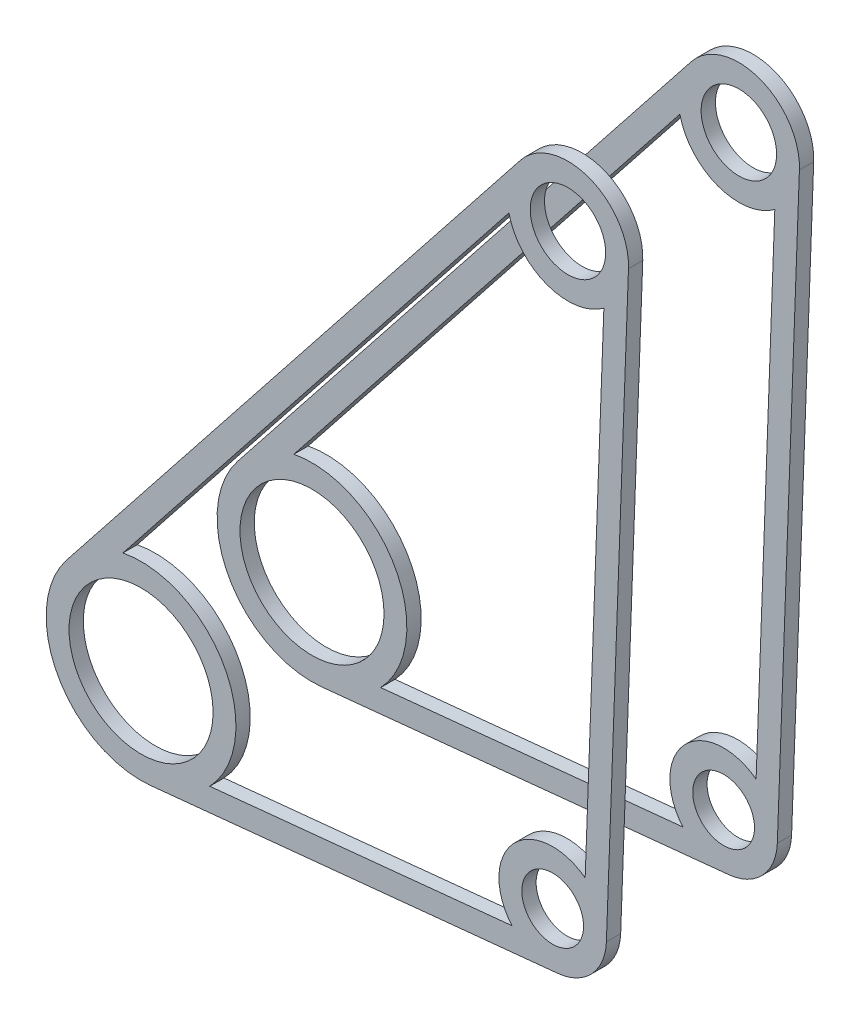
ISO-10303-21;
HEADER;
FILE_DESCRIPTION(('STEP AP214'),'2;1');
FILE_NAME('part.step','',(''),(''),'','','');
FILE_SCHEMA(('AUTOMOTIVE_DESIGN { 1 0 10303 214 1 1 1 1 }'));
ENDSEC;
DATA;
#1=APPLICATION_CONTEXT('core data for automotive mechanical design processes');
#2=APPLICATION_PROTOCOL_DEFINITION('international standard','automotive_design',2000,#1);
#3=PRODUCT_CONTEXT('',#1,'mechanical');
#4=PRODUCT('Part','Part','',(#3));
#5=PRODUCT_RELATED_PRODUCT_CATEGORY('part','',(#4));
#6=PRODUCT_DEFINITION_FORMATION('','',#4);
#7=PRODUCT_DEFINITION_CONTEXT('part definition',#1,'design');
#8=PRODUCT_DEFINITION('design','',#6,#7);
#9=PRODUCT_DEFINITION_SHAPE('','',#8);
#10=(LENGTH_UNIT() NAMED_UNIT(*) SI_UNIT(.MILLI.,.METRE.));
#11=(NAMED_UNIT(*) PLANE_ANGLE_UNIT() SI_UNIT($,.RADIAN.));
#12=(NAMED_UNIT(*) SI_UNIT($,.STERADIAN.) SOLID_ANGLE_UNIT());
#13=UNCERTAINTY_MEASURE_WITH_UNIT(LENGTH_MEASURE(1.E-05),#10,'distance_accuracy_value','');
#14=(GEOMETRIC_REPRESENTATION_CONTEXT(3) GLOBAL_UNCERTAINTY_ASSIGNED_CONTEXT((#13)) GLOBAL_UNIT_ASSIGNED_CONTEXT((#10,
#11,#12)) REPRESENTATION_CONTEXT('',''));
#15=CARTESIAN_POINT('',(0.,0.,0.));
#16=DIRECTION('',(0.,0.,1.));
#17=DIRECTION('',(1.,0.,0.));
#18=AXIS2_PLACEMENT_3D('',#15,#16,#17);
#19=CARTESIAN_POINT('',(45.72,0.,-10.287));
#20=DIRECTION('',(0.,0.,1.));
#21=DIRECTION('',(1.,0.,0.));
#22=AXIS2_PLACEMENT_3D('',#19,#20,#21);
#23=CYLINDRICAL_SURFACE('',#22,5.96900000000001);
#24=CARTESIAN_POINT('',(45.72,0.,-8.6995));
#25=DIRECTION('',(0.,0.,1.));
#26=DIRECTION('',(1.,0.,0.));
#27=AXIS2_PLACEMENT_3D('',#24,#25,#26);
#28=CIRCLE('',#27,5.96900000000001);
#29=CARTESIAN_POINT('',(46.3169,-5.93908001208942,-8.6995));
#30=VERTEX_POINT('',#29);
#31=CARTESIAN_POINT('',(51.6848742778661,-0.221891525865466,-8.6995));
#32=VERTEX_POINT('',#31);
#33=EDGE_CURVE('E206',#30,#32,#28,.T.);
#34=ORIENTED_EDGE('',*,*,#33,.F.);
#35=DIRECTION('',(0.,0.,1.));
#36=VECTOR('',#35,1.);
#37=CARTESIAN_POINT('',(46.3169,-5.93908001208942,-10.287));
#38=LINE('',#37,#36);
#39=CARTESIAN_POINT('',(46.3169,-5.93908001208942,-10.287));
#40=VERTEX_POINT('',#39);
#41=EDGE_CURVE('E12',#40,#30,#38,.T.);
#42=ORIENTED_EDGE('',*,*,#41,.F.);
#43=CARTESIAN_POINT('',(45.72,0.,-10.287));
#44=DIRECTION('',(0.,0.,1.));
#45=DIRECTION('',(1.,0.,0.));
#46=AXIS2_PLACEMENT_3D('',#43,#44,#45);
#47=CIRCLE('',#46,5.96900000000001);
#48=CARTESIAN_POINT('',(51.6848742778661,-0.221891525865466,-10.287));
#49=VERTEX_POINT('',#48);
#50=EDGE_CURVE('E306',#40,#49,#47,.T.);
#51=ORIENTED_EDGE('',*,*,#50,.T.);
#52=DIRECTION('',(0.,0.,1.));
#53=VECTOR('',#52,1.);
#54=CARTESIAN_POINT('',(51.6848742778661,-0.221891525865466,-10.287));
#55=LINE('',#54,#53);
#56=EDGE_CURVE('E228',#49,#32,#55,.T.);
#57=ORIENTED_EDGE('',*,*,#56,.T.);
#58=EDGE_LOOP('',(#34,#42,#51,#57));
#59=FACE_BOUND('',#58,.T.);
#60=ADVANCED_FACE('F57',(#59),#23,.T.);
#61=CARTESIAN_POINT('',(1.0541,-10.4881625745409,-10.287));
#62=DIRECTION('',(-0.1,0.99498743710662,0.));
#63=DIRECTION('',(-0.99498743710662,-0.1,0.));
#64=AXIS2_PLACEMENT_3D('',#61,#62,#63);
#65=PLANE('',#64);
#66=DIRECTION('',(-0.99498743710662,-0.1,0.));
#67=VECTOR('',#66,1.);
#68=CARTESIAN_POINT('',(1.0541,-10.4881625745409,-8.6995));
#69=LINE('',#68,#67);
#70=CARTESIAN_POINT('',(1.0541,-10.4881625745409,-8.6995));
#71=VERTEX_POINT('',#70);
#72=EDGE_CURVE('E218',#30,#71,#69,.T.);
#73=ORIENTED_EDGE('',*,*,#72,.T.);
#74=DIRECTION('',(0.,0.,1.));
#75=VECTOR('',#74,1.);
#76=CARTESIAN_POINT('',(1.0541,-10.4881625745409,-10.287));
#77=LINE('',#76,#75);
#78=CARTESIAN_POINT('',(1.0541,-10.4881625745409,-10.287));
#79=VERTEX_POINT('',#78);
#80=EDGE_CURVE('E67',#79,#71,#77,.T.);
#81=ORIENTED_EDGE('',*,*,#80,.F.);
#82=DIRECTION('',(-0.99498743710662,-0.1,0.));
#83=VECTOR('',#82,1.);
#84=CARTESIAN_POINT('',(1.0541,-10.4881625745409,-10.287));
#85=LINE('',#84,#83);
#86=EDGE_CURVE('E174',#40,#79,#85,.T.);
#87=ORIENTED_EDGE('',*,*,#86,.F.);
#88=ORIENTED_EDGE('',*,*,#41,.T.);
#89=EDGE_LOOP('',(#73,#81,#87,#88));
#90=FACE_BOUND('',#89,.T.);
#91=ADVANCED_FACE('F265',(#90),#65,.F.);
#92=CARTESIAN_POINT('',(0.,0.,-10.287));
#93=DIRECTION('',(0.,0.,1.));
#94=DIRECTION('',(1.,0.,0.));
#95=AXIS2_PLACEMENT_3D('',#92,#93,#94);
#96=CYLINDRICAL_SURFACE('',#95,10.541);
#97=CARTESIAN_POINT('',(0.,0.,-8.6995));
#98=DIRECTION('',(0.,0.,1.));
#99=DIRECTION('',(1.,0.,0.));
#100=AXIS2_PLACEMENT_3D('',#97,#98,#99);
#101=CIRCLE('',#100,10.541);
#102=CARTESIAN_POINT('',(-8.26410474188352,6.54348942195052,-8.6995));
#103=VERTEX_POINT('',#102);
#104=EDGE_CURVE('E157',#103,#71,#101,.T.);
#105=ORIENTED_EDGE('',*,*,#104,.F.);
#106=DIRECTION('',(0.,0.,1.));
#107=VECTOR('',#106,1.);
#108=CARTESIAN_POINT('',(-8.26410474188352,6.54348942195052,-10.287));
#109=LINE('',#108,#107);
#110=CARTESIAN_POINT('',(-8.26410474188352,6.54348942195052,-10.287));
#111=VERTEX_POINT('',#110);
#112=EDGE_CURVE('E151',#111,#103,#109,.T.);
#113=ORIENTED_EDGE('',*,*,#112,.F.);
#114=CARTESIAN_POINT('',(0.,0.,-10.287));
#115=DIRECTION('',(0.,0.,1.));
#116=DIRECTION('',(1.,0.,0.));
#117=AXIS2_PLACEMENT_3D('',#114,#115,#116);
#118=CIRCLE('',#117,10.541);
#119=EDGE_CURVE('E155',#111,#79,#118,.T.);
#120=ORIENTED_EDGE('',*,*,#119,.T.);
#121=ORIENTED_EDGE('',*,*,#80,.T.);
#122=EDGE_LOOP('',(#105,#113,#120,#121));
#123=FACE_BOUND('',#122,.T.);
#124=ADVANCED_FACE('F153',(#123),#96,.T.);
#125=CARTESIAN_POINT('',(-8.26410474188352,6.54348942195053,-10.287));
#126=DIRECTION('',(0.783996275674368,-0.620765527174891,0.));
#127=DIRECTION('',(0.620765527174891,0.783996275674368,0.));
#128=AXIS2_PLACEMENT_3D('',#125,#126,#127);
#129=PLANE('',#128);
#130=DIRECTION('',(0.620765527174891,0.783996275674368,0.));
#131=VECTOR('',#130,1.);
#132=CARTESIAN_POINT('',(-8.26410474188352,6.54348942195053,-8.6995));
#133=LINE('',#132,#131);
#134=CARTESIAN_POINT('',(42.1362544017692,70.1966597922536,-8.6995));
#135=VERTEX_POINT('',#134);
#136=EDGE_CURVE('E215',#103,#135,#133,.T.);
#137=ORIENTED_EDGE('',*,*,#136,.T.);
#138=DIRECTION('',(0.,0.,1.));
#139=VECTOR('',#138,1.);
#140=CARTESIAN_POINT('',(42.1362544017692,70.1966597922536,-10.287));
#141=LINE('',#140,#139);
#142=CARTESIAN_POINT('',(42.1362544017692,70.1966597922536,-10.287));
#143=VERTEX_POINT('',#142);
#144=EDGE_CURVE('E161',#143,#135,#141,.T.);
#145=ORIENTED_EDGE('',*,*,#144,.F.);
#146=DIRECTION('',(0.620765527174891,0.783996275674368,0.));
#147=VECTOR('',#146,1.);
#148=CARTESIAN_POINT('',(-8.26410474188352,6.54348942195053,-10.287));
#149=LINE('',#148,#147);
#150=EDGE_CURVE('E164',#111,#143,#149,.T.);
#151=ORIENTED_EDGE('',*,*,#150,.F.);
#152=ORIENTED_EDGE('',*,*,#112,.T.);
#153=EDGE_LOOP('',(#137,#145,#151,#152));
#154=FACE_BOUND('',#153,.T.);
#155=ADVANCED_FACE('F165',(#154),#129,.F.);
#156=CARTESIAN_POINT('',(47.4133333333333,66.0182870288394,-10.287));
#157=DIRECTION('',(0.,0.,1.));
#158=DIRECTION('',(1.,0.,0.));
#159=AXIS2_PLACEMENT_3D('',#156,#157,#158);
#160=CYLINDRICAL_SURFACE('',#159,6.73099999999992);
#161=CARTESIAN_POINT('',(47.4133333333333,66.0182870288394,-8.6995));
#162=DIRECTION('',(0.,0.,1.));
#163=DIRECTION('',(1.,0.,0.));
#164=AXIS2_PLACEMENT_3D('',#161,#162,#163);
#165=CIRCLE('',#164,6.73099999999992);
#166=CARTESIAN_POINT('',(54.1396809232675,65.7680689252039,-8.6995));
#167=VERTEX_POINT('',#166);
#168=EDGE_CURVE('E212',#167,#135,#165,.T.);
#169=ORIENTED_EDGE('',*,*,#168,.F.);
#170=DIRECTION('',(0.,0.,1.));
#171=VECTOR('',#170,1.);
#172=CARTESIAN_POINT('',(54.1396809232675,65.7680689252039,-10.287));
#173=LINE('',#172,#171);
#174=CARTESIAN_POINT('',(54.1396809232675,65.7680689252039,-10.287));
#175=VERTEX_POINT('',#174);
#176=EDGE_CURVE('E226',#175,#167,#173,.T.);
#177=ORIENTED_EDGE('',*,*,#176,.F.);
#178=CARTESIAN_POINT('',(47.4133333333333,66.0182870288394,-10.287));
#179=DIRECTION('',(0.,0.,1.));
#180=DIRECTION('',(1.,0.,0.));
#181=AXIS2_PLACEMENT_3D('',#178,#179,#180);
#182=CIRCLE('',#181,6.73099999999992);
#183=EDGE_CURVE('E169',#175,#143,#182,.T.);
#184=ORIENTED_EDGE('',*,*,#183,.T.);
#185=ORIENTED_EDGE('',*,*,#144,.T.);
#186=EDGE_LOOP('',(#169,#177,#184,#185));
#187=FACE_BOUND('',#186,.T.);
#188=ADVANCED_FACE('F315',(#187),#160,.T.);
#189=CARTESIAN_POINT('',(49.0834491950019,-1.82588952076208,-10.287));
#190=DIRECTION('',(0.999308808488212,-0.0371739865748812,0.));
#191=DIRECTION('',(0.0371739865748812,0.999308808488212,0.));
#192=AXIS2_PLACEMENT_3D('',#189,#190,#191);
#193=PLANE('',#192);
#194=DIRECTION('',(0.0371739865748812,0.999308808488212,0.));
#195=VECTOR('',#194,1.);
#196=CARTESIAN_POINT('',(49.0834491950019,-1.82588952076208,-8.6995));
#197=LINE('',#196,#195);
#198=CARTESIAN_POINT('',(49.3282541051594,4.75494093681516,-8.6995));
#199=VERTEX_POINT('',#198);
#200=CARTESIAN_POINT('',(51.4056390768177,60.5990752918299,-8.6995));
#201=VERTEX_POINT('',#200);
#202=EDGE_CURVE('E185',#199,#201,#197,.T.);
#203=ORIENTED_EDGE('',*,*,#202,.T.);
#204=DIRECTION('',(0.,0.,1.));
#205=VECTOR('',#204,1.);
#206=CARTESIAN_POINT('',(51.4056390768177,60.5990752918299,-10.287));
#207=LINE('',#206,#205);
#208=CARTESIAN_POINT('',(51.4056390768177,60.5990752918299,-10.287));
#209=VERTEX_POINT('',#208);
#210=EDGE_CURVE('E230',#209,#201,#207,.T.);
#211=ORIENTED_EDGE('',*,*,#210,.F.);
#212=DIRECTION('',(0.0371739865748812,0.999308808488212,0.));
#213=VECTOR('',#212,1.);
#214=CARTESIAN_POINT('',(49.0834491950019,-1.82588952076208,-10.287));
#215=LINE('',#214,#213);
#216=CARTESIAN_POINT('',(49.3282541051594,4.75494093681516,-10.287));
#217=VERTEX_POINT('',#216);
#218=EDGE_CURVE('E243',#217,#209,#215,.T.);
#219=ORIENTED_EDGE('',*,*,#218,.F.);
#220=DIRECTION('',(0.,0.,1.));
#221=VECTOR('',#220,1.);
#222=CARTESIAN_POINT('',(49.3282541051594,4.75494093681516,-10.287));
#223=LINE('',#222,#221);
#224=EDGE_CURVE('E61',#217,#199,#223,.T.);
#225=ORIENTED_EDGE('',*,*,#224,.T.);
#226=EDGE_LOOP('',(#203,#211,#219,#225));
#227=FACE_BOUND('',#226,.T.);
#228=ADVANCED_FACE('F241',(#227),#193,.F.);
#229=CARTESIAN_POINT('',(47.4133333333333,66.0182870288394,-10.287));
#230=DIRECTION('',(0.,0.,1.));
#231=DIRECTION('',(1.,0.,0.));
#232=AXIS2_PLACEMENT_3D('',#229,#230,#231);
#233=CYLINDRICAL_SURFACE('',#232,6.73099999999992);
#234=CARTESIAN_POINT('',(47.4133333333333,66.0182870288394,-8.6995));
#235=DIRECTION('',(0.,0.,1.));
#236=DIRECTION('',(1.,0.,0.));
#237=AXIS2_PLACEMENT_3D('',#234,#235,#236);
#238=CIRCLE('',#237,6.73099999999992);
#239=CARTESIAN_POINT('',(40.857998083081,64.4905629841252,-8.6995));
#240=VERTEX_POINT('',#239);
#241=EDGE_CURVE('E200',#240,#201,#238,.T.);
#242=ORIENTED_EDGE('',*,*,#241,.F.);
#243=DIRECTION('',(0.,0.,1.));
#244=VECTOR('',#243,1.);
#245=CARTESIAN_POINT('',(40.857998083081,64.4905629841252,-10.287));
#246=LINE('',#245,#244);
#247=CARTESIAN_POINT('',(40.857998083081,64.4905629841252,-10.287));
#248=VERTEX_POINT('',#247);
#249=EDGE_CURVE('E232',#248,#240,#246,.T.);
#250=ORIENTED_EDGE('',*,*,#249,.F.);
#251=CARTESIAN_POINT('',(47.4133333333333,66.0182870288394,-10.287));
#252=DIRECTION('',(0.,0.,1.));
#253=DIRECTION('',(1.,0.,0.));
#254=AXIS2_PLACEMENT_3D('',#251,#252,#253);
#255=CIRCLE('',#254,6.73099999999992);
#256=EDGE_CURVE('E300',#248,#209,#255,.T.);
#257=ORIENTED_EDGE('',*,*,#256,.T.);
#258=ORIENTED_EDGE('',*,*,#210,.T.);
#259=EDGE_LOOP('',(#242,#250,#257,#258));
#260=FACE_BOUND('',#259,.T.);
#261=ADVANCED_FACE('F273',(#260),#233,.T.);
#262=CARTESIAN_POINT('',(-6.27275420167062,4.9667449829263,-10.287));
#263=DIRECTION('',(0.783996275674368,-0.620765527174891,0.));
#264=DIRECTION('',(0.620765527174891,0.783996275674368,0.));
#265=AXIS2_PLACEMENT_3D('',#262,#263,#264);
#266=PLANE('',#265);
#267=DIRECTION('',(0.620765527174891,0.783996275674368,0.));
#268=VECTOR('',#267,1.);
#269=CARTESIAN_POINT('',(-6.27275420167062,4.9667449829263,-8.6995));
#270=LINE('',#269,#268);
#271=CARTESIAN_POINT('',(-2.01262531984617,10.3470778639147,-8.6995));
#272=VERTEX_POINT('',#271);
#273=EDGE_CURVE('E197',#272,#240,#270,.T.);
#274=ORIENTED_EDGE('',*,*,#273,.F.);
#275=DIRECTION('',(0.,0.,1.));
#276=VECTOR('',#275,1.);
#277=CARTESIAN_POINT('',(-2.01262531984617,10.3470778639147,-10.287));
#278=LINE('',#277,#276);
#279=CARTESIAN_POINT('',(-2.01262531984617,10.3470778639147,-10.287));
#280=VERTEX_POINT('',#279);
#281=EDGE_CURVE('E234',#280,#272,#278,.T.);
#282=ORIENTED_EDGE('',*,*,#281,.F.);
#283=DIRECTION('',(0.620765527174891,0.783996275674368,0.));
#284=VECTOR('',#283,1.);
#285=CARTESIAN_POINT('',(-6.27275420167062,4.9667449829263,-10.287));
#286=LINE('',#285,#284);
#287=EDGE_CURVE('E303',#280,#248,#286,.T.);
#288=ORIENTED_EDGE('',*,*,#287,.T.);
#289=ORIENTED_EDGE('',*,*,#249,.T.);
#290=EDGE_LOOP('',(#274,#282,#288,#289));
#291=FACE_BOUND('',#290,.T.);
#292=ADVANCED_FACE('F275',(#291),#266,.T.);
#293=CARTESIAN_POINT('',(0.,0.,-10.287));
#294=DIRECTION('',(0.,0.,1.));
#295=DIRECTION('',(1.,0.,0.));
#296=AXIS2_PLACEMENT_3D('',#293,#294,#295);
#297=CYLINDRICAL_SURFACE('',#296,10.541);
#298=CARTESIAN_POINT('',(0.,0.,-8.6995));
#299=DIRECTION('',(0.,0.,1.));
#300=DIRECTION('',(1.,0.,0.));
#301=AXIS2_PLACEMENT_3D('',#298,#299,#300);
#302=CIRCLE('',#301,10.541);
#303=CARTESIAN_POINT('',(7.62840236588861,-7.27462427511587,-8.6995));
#304=VERTEX_POINT('',#303);
#305=EDGE_CURVE('E194',#304,#272,#302,.T.);
#306=ORIENTED_EDGE('',*,*,#305,.F.);
#307=DIRECTION('',(0.,0.,1.));
#308=VECTOR('',#307,1.);
#309=CARTESIAN_POINT('',(7.62840236588861,-7.27462427511587,-10.287));
#310=LINE('',#309,#308);
#311=CARTESIAN_POINT('',(7.62840236588861,-7.27462427511587,-10.287));
#312=VERTEX_POINT('',#311);
#313=EDGE_CURVE('E236',#312,#304,#310,.T.);
#314=ORIENTED_EDGE('',*,*,#313,.F.);
#315=CARTESIAN_POINT('',(0.,0.,-10.287));
#316=DIRECTION('',(0.,0.,1.));
#317=DIRECTION('',(1.,0.,0.));
#318=AXIS2_PLACEMENT_3D('',#315,#316,#317);
#319=CIRCLE('',#318,10.541);
#320=EDGE_CURVE('E295',#312,#280,#319,.T.);
#321=ORIENTED_EDGE('',*,*,#320,.T.);
#322=ORIENTED_EDGE('',*,*,#281,.T.);
#323=EDGE_LOOP('',(#306,#314,#321,#322));
#324=FACE_BOUND('',#323,.T.);
#325=ADVANCED_FACE('F279',(#324),#297,.T.);
#326=CARTESIAN_POINT('',(0.8001,-7.96089448429007,-10.287));
#327=DIRECTION('',(0.1,-0.99498743710662,0.));
#328=DIRECTION('',(0.99498743710662,0.1,0.));
#329=AXIS2_PLACEMENT_3D('',#326,#327,#328);
#330=PLANE('',#329);
#331=DIRECTION('',(0.99498743710662,0.1,0.));
#332=VECTOR('',#331,1.);
#333=CARTESIAN_POINT('',(0.8001,-7.96089448429007,-8.6995));
#334=LINE('',#333,#332);
#335=CARTESIAN_POINT('',(41.2016027657219,-3.90039067700505,-8.6995));
#336=VERTEX_POINT('',#335);
#337=EDGE_CURVE('E191',#304,#336,#334,.T.);
#338=ORIENTED_EDGE('',*,*,#337,.T.);
#339=DIRECTION('',(0.,0.,1.));
#340=VECTOR('',#339,1.);
#341=CARTESIAN_POINT('',(41.2016027657219,-3.90039067700505,-10.287));
#342=LINE('',#341,#340);
#343=CARTESIAN_POINT('',(41.2016027657219,-3.90039067700505,-10.287));
#344=VERTEX_POINT('',#343);
#345=EDGE_CURVE('E237',#344,#336,#342,.T.);
#346=ORIENTED_EDGE('',*,*,#345,.F.);
#347=DIRECTION('',(0.99498743710662,0.1,0.));
#348=VECTOR('',#347,1.);
#349=CARTESIAN_POINT('',(0.8001,-7.96089448429007,-10.287));
#350=LINE('',#349,#348);
#351=EDGE_CURVE('E505',#312,#344,#350,.T.);
#352=ORIENTED_EDGE('',*,*,#351,.F.);
#353=ORIENTED_EDGE('',*,*,#313,.T.);
#354=EDGE_LOOP('',(#338,#346,#352,#353));
#355=FACE_BOUND('',#354,.T.);
#356=ADVANCED_FACE('F282',(#355),#330,.F.);
#357=CARTESIAN_POINT('',(51.6216935685619,-1.92031144666228,-10.287));
#358=DIRECTION('',(-0.999308808488212,0.0371739865748813,0.));
#359=DIRECTION('',(-0.0371739865748813,-0.999308808488212,0.));
#360=AXIS2_PLACEMENT_3D('',#357,#358,#359);
#361=PLANE('',#360);
#362=DIRECTION('',(-0.0371739865748813,-0.999308808488212,0.));
#363=VECTOR('',#362,1.);
#364=CARTESIAN_POINT('',(51.6216935685619,-1.92031144666228,-8.6995));
#365=LINE('',#364,#363);
#366=EDGE_CURVE('E209',#167,#32,#365,.T.);
#367=ORIENTED_EDGE('',*,*,#366,.T.);
#368=ORIENTED_EDGE('',*,*,#56,.F.);
#369=DIRECTION('',(-0.0371739865748813,-0.999308808488212,0.));
#370=VECTOR('',#369,1.);
#371=CARTESIAN_POINT('',(51.6216935685619,-1.92031144666228,-10.287));
#372=LINE('',#371,#370);
#373=EDGE_CURVE('E312',#175,#49,#372,.T.);
#374=ORIENTED_EDGE('',*,*,#373,.F.);
#375=ORIENTED_EDGE('',*,*,#176,.T.);
#376=EDGE_LOOP('',(#367,#368,#374,#375));
#377=FACE_BOUND('',#376,.T.);
#378=ADVANCED_FACE('F261',(#377),#361,.F.);
#379=CARTESIAN_POINT('',(47.4133333333333,66.0182870288394,-10.287));
#380=DIRECTION('',(0.,0.,1.));
#381=DIRECTION('',(1.,0.,0.));
#382=AXIS2_PLACEMENT_3D('',#379,#380,#381);
#383=CYLINDRICAL_SURFACE('',#382,4.1910000000001);
#384=CARTESIAN_POINT('',(47.4133333333333,66.0182870288394,-10.287));
#385=DIRECTION('',(0.,0.,1.));
#386=DIRECTION('',(1.,0.,0.));
#387=AXIS2_PLACEMENT_3D('',#384,#385,#386);
#388=CIRCLE('',#387,4.1910000000001);
#389=CARTESIAN_POINT('',(51.6043333333335,66.0182870288394,-10.287));
#390=VERTEX_POINT('',#389);
#391=EDGE_CURVE('E302',#390,#390,#388,.T.);
#392=ORIENTED_EDGE('',*,*,#391,.F.);
#393=EDGE_LOOP('',(#392));
#394=FACE_BOUND('',#393,.T.);
#395=CARTESIAN_POINT('',(47.4133333333333,66.0182870288394,-8.6995));
#396=DIRECTION('',(0.,0.,1.));
#397=DIRECTION('',(1.,0.,0.));
#398=AXIS2_PLACEMENT_3D('',#395,#396,#397);
#399=CIRCLE('',#398,4.1910000000001);
#400=CARTESIAN_POINT('',(51.6043333333335,66.0182870288394,-8.6995));
#401=VERTEX_POINT('',#400);
#402=EDGE_CURVE('E203',#401,#401,#399,.T.);
#403=ORIENTED_EDGE('',*,*,#402,.T.);
#404=EDGE_LOOP('',(#403));
#405=FACE_BOUND('',#404,.T.);
#406=ADVANCED_FACE('F252',(#394,#405),#383,.F.);
#407=CARTESIAN_POINT('',(45.72,0.,-10.287));
#408=DIRECTION('',(0.,0.,1.));
#409=DIRECTION('',(1.,0.,0.));
#410=AXIS2_PLACEMENT_3D('',#407,#408,#409);
#411=CYLINDRICAL_SURFACE('',#410,5.96900000000001);
#412=CARTESIAN_POINT('',(45.72,0.,-8.6995));
#413=DIRECTION('',(0.,0.,1.));
#414=DIRECTION('',(1.,0.,0.));
#415=AXIS2_PLACEMENT_3D('',#412,#413,#414);
#416=CIRCLE('',#415,5.96900000000001);
#417=EDGE_CURVE('E188',#199,#336,#416,.T.);
#418=ORIENTED_EDGE('',*,*,#417,.F.);
#419=ORIENTED_EDGE('',*,*,#224,.F.);
#420=CARTESIAN_POINT('',(45.72,0.,-10.287));
#421=DIRECTION('',(0.,0.,1.));
#422=DIRECTION('',(1.,0.,0.));
#423=AXIS2_PLACEMENT_3D('',#420,#421,#422);
#424=CIRCLE('',#423,5.96900000000001);
#425=EDGE_CURVE('E503',#217,#344,#424,.T.);
#426=ORIENTED_EDGE('',*,*,#425,.T.);
#427=ORIENTED_EDGE('',*,*,#345,.T.);
#428=EDGE_LOOP('',(#418,#419,#426,#427));
#429=FACE_BOUND('',#428,.T.);
#430=ADVANCED_FACE('F250',(#429),#411,.T.);
#431=CARTESIAN_POINT('',(45.72,0.,-10.287));
#432=DIRECTION('',(0.,0.,1.));
#433=DIRECTION('',(1.,0.,0.));
#434=AXIS2_PLACEMENT_3D('',#431,#432,#433);
#435=CYLINDRICAL_SURFACE('',#434,3.42899999999998);
#436=CARTESIAN_POINT('',(45.72,0.,-10.287));
#437=DIRECTION('',(0.,0.,1.));
#438=DIRECTION('',(1.,0.,0.));
#439=AXIS2_PLACEMENT_3D('',#436,#437,#438);
#440=CIRCLE('',#439,3.42899999999998);
#441=CARTESIAN_POINT('',(49.149,0.,-10.287));
#442=VERTEX_POINT('',#441);
#443=EDGE_CURVE('E222',#442,#442,#440,.T.);
#444=ORIENTED_EDGE('',*,*,#443,.F.);
#445=EDGE_LOOP('',(#444));
#446=FACE_BOUND('',#445,.T.);
#447=CARTESIAN_POINT('',(45.72,0.,-8.6995));
#448=DIRECTION('',(0.,0.,1.));
#449=DIRECTION('',(1.,0.,0.));
#450=AXIS2_PLACEMENT_3D('',#447,#448,#449);
#451=CIRCLE('',#450,3.42899999999998);
#452=CARTESIAN_POINT('',(49.149,0.,-8.6995));
#453=VERTEX_POINT('',#452);
#454=EDGE_CURVE('E182',#453,#453,#451,.T.);
#455=ORIENTED_EDGE('',*,*,#454,.T.);
#456=EDGE_LOOP('',(#455));
#457=FACE_BOUND('',#456,.T.);
#458=ADVANCED_FACE('F59',(#446,#457),#435,.F.);
#459=CARTESIAN_POINT('',(0.,0.,-10.287));
#460=DIRECTION('',(0.,0.,1.));
#461=DIRECTION('',(1.,0.,0.));
#462=AXIS2_PLACEMENT_3D('',#459,#460,#461);
#463=CYLINDRICAL_SURFACE('',#462,8.001);
#464=CARTESIAN_POINT('',(0.,0.,-10.287));
#465=DIRECTION('',(0.,0.,1.));
#466=DIRECTION('',(1.,0.,0.));
#467=AXIS2_PLACEMENT_3D('',#464,#465,#466);
#468=CIRCLE('',#467,8.001);
#469=CARTESIAN_POINT('',(8.001,0.,-10.287));
#470=VERTEX_POINT('',#469);
#471=EDGE_CURVE('E176',#470,#470,#468,.T.);
#472=ORIENTED_EDGE('',*,*,#471,.F.);
#473=EDGE_LOOP('',(#472));
#474=FACE_BOUND('',#473,.T.);
#475=CARTESIAN_POINT('',(0.,0.,-8.6995));
#476=DIRECTION('',(0.,0.,1.));
#477=DIRECTION('',(1.,0.,0.));
#478=AXIS2_PLACEMENT_3D('',#475,#476,#477);
#479=CIRCLE('',#478,8.001);
#480=CARTESIAN_POINT('',(8.001,0.,-8.6995));
#481=VERTEX_POINT('',#480);
#482=EDGE_CURVE('E220',#481,#481,#479,.T.);
#483=ORIENTED_EDGE('',*,*,#482,.T.);
#484=EDGE_LOOP('',(#483));
#485=FACE_BOUND('',#484,.T.);
#486=ADVANCED_FACE('F258',(#474,#485),#463,.F.);
#487=CARTESIAN_POINT('',(0.,0.,-10.287));
#488=DIRECTION('',(0.,0.,1.));
#489=DIRECTION('',(1.,0.,0.));
#490=AXIS2_PLACEMENT_3D('',#487,#488,#489);
#491=PLANE('',#490);
#492=ORIENTED_EDGE('',*,*,#443,.T.);
#493=EDGE_LOOP('',(#492));
#494=FACE_BOUND('',#493,.T.);
#495=ORIENTED_EDGE('',*,*,#218,.T.);
#496=ORIENTED_EDGE('',*,*,#256,.F.);
#497=ORIENTED_EDGE('',*,*,#287,.F.);
#498=ORIENTED_EDGE('',*,*,#320,.F.);
#499=ORIENTED_EDGE('',*,*,#351,.T.);
#500=ORIENTED_EDGE('',*,*,#425,.F.);
#501=EDGE_LOOP('',(#495,#496,#497,#498,#499,#500));
#502=FACE_BOUND('',#501,.T.);
#503=ORIENTED_EDGE('',*,*,#391,.T.);
#504=EDGE_LOOP('',(#503));
#505=FACE_BOUND('',#504,.T.);
#506=ORIENTED_EDGE('',*,*,#50,.F.);
#507=ORIENTED_EDGE('',*,*,#86,.T.);
#508=ORIENTED_EDGE('',*,*,#119,.F.);
#509=ORIENTED_EDGE('',*,*,#150,.T.);
#510=ORIENTED_EDGE('',*,*,#183,.F.);
#511=ORIENTED_EDGE('',*,*,#373,.T.);
#512=EDGE_LOOP('',(#506,#507,#508,#509,#510,#511));
#513=FACE_BOUND('',#512,.T.);
#514=ORIENTED_EDGE('',*,*,#471,.T.);
#515=EDGE_LOOP('',(#514));
#516=FACE_BOUND('',#515,.T.);
#517=ADVANCED_FACE('F172',(#494,#502,#505,#513,#516),#491,.F.);
#518=CARTESIAN_POINT('',(0.,0.,-8.6995));
#519=DIRECTION('',(0.,0.,1.));
#520=DIRECTION('',(1.,0.,0.));
#521=AXIS2_PLACEMENT_3D('',#518,#519,#520);
#522=PLANE('',#521);
#523=ORIENTED_EDGE('',*,*,#454,.F.);
#524=EDGE_LOOP('',(#523));
#525=FACE_BOUND('',#524,.T.);
#526=ORIENTED_EDGE('',*,*,#202,.F.);
#527=ORIENTED_EDGE('',*,*,#417,.T.);
#528=ORIENTED_EDGE('',*,*,#337,.F.);
#529=ORIENTED_EDGE('',*,*,#305,.T.);
#530=ORIENTED_EDGE('',*,*,#273,.T.);
#531=ORIENTED_EDGE('',*,*,#241,.T.);
#532=EDGE_LOOP('',(#526,#527,#528,#529,#530,#531));
#533=FACE_BOUND('',#532,.T.);
#534=ORIENTED_EDGE('',*,*,#402,.F.);
#535=EDGE_LOOP('',(#534));
#536=FACE_BOUND('',#535,.T.);
#537=ORIENTED_EDGE('',*,*,#33,.T.);
#538=ORIENTED_EDGE('',*,*,#366,.F.);
#539=ORIENTED_EDGE('',*,*,#168,.T.);
#540=ORIENTED_EDGE('',*,*,#136,.F.);
#541=ORIENTED_EDGE('',*,*,#104,.T.);
#542=ORIENTED_EDGE('',*,*,#72,.F.);
#543=EDGE_LOOP('',(#537,#538,#539,#540,#541,#542));
#544=FACE_BOUND('',#543,.T.);
#545=ORIENTED_EDGE('',*,*,#482,.F.);
#546=EDGE_LOOP('',(#545));
#547=FACE_BOUND('',#546,.T.);
#548=ADVANCED_FACE('F246',(#525,#533,#536,#544,#547),#522,.T.);
#549=CLOSED_SHELL('',(#60,#91,#124,#155,#188,#228,#261,#292,#325,#356,#378,#406,#430,#458,#486,
#517,#548));
#550=MANIFOLD_SOLID_BREP('B2',#549);
#551=CARTESIAN_POINT('',(45.72,0.,10.287));
#552=DIRECTION('',(0.,0.,-1.));
#553=DIRECTION('',(-1.,0.,0.));
#554=AXIS2_PLACEMENT_3D('',#551,#552,#553);
#555=CYLINDRICAL_SURFACE('',#554,5.96900000000001);
#556=CARTESIAN_POINT('',(45.72,0.,8.6995));
#557=DIRECTION('',(0.,0.,1.));
#558=DIRECTION('',(1.,0.,0.));
#559=AXIS2_PLACEMENT_3D('',#556,#557,#558);
#560=CIRCLE('',#559,5.96900000000001);
#561=CARTESIAN_POINT('',(46.3169,-5.93908001208942,8.6995));
#562=VERTEX_POINT('',#561);
#563=CARTESIAN_POINT('',(51.6848742778661,-0.221891525865466,8.6995));
#564=VERTEX_POINT('',#563);
#565=EDGE_CURVE('E668',#562,#564,#560,.T.);
#566=ORIENTED_EDGE('',*,*,#565,.T.);
#567=DIRECTION('',(0.,0.,-1.));
#568=VECTOR('',#567,1.);
#569=CARTESIAN_POINT('',(51.6848742778661,-0.221891525865466,10.287));
#570=LINE('',#569,#568);
#571=CARTESIAN_POINT('',(51.6848742778661,-0.221891525865466,10.287));
#572=VERTEX_POINT('',#571);
#573=EDGE_CURVE('E55',#572,#564,#570,.T.);
#574=ORIENTED_EDGE('',*,*,#573,.F.);
#575=CARTESIAN_POINT('',(45.72,0.,10.287));
#576=DIRECTION('',(0.,0.,1.));
#577=DIRECTION('',(1.,0.,0.));
#578=AXIS2_PLACEMENT_3D('',#575,#576,#577);
#579=CIRCLE('',#578,5.96900000000001);
#580=CARTESIAN_POINT('',(46.3169,-5.93908001208942,10.287));
#581=VERTEX_POINT('',#580);
#582=EDGE_CURVE('E743',#581,#572,#579,.T.);
#583=ORIENTED_EDGE('',*,*,#582,.F.);
#584=DIRECTION('',(0.,0.,-1.));
#585=VECTOR('',#584,1.);
#586=CARTESIAN_POINT('',(46.3169,-5.93908001208942,10.287));
#587=LINE('',#586,#585);
#588=EDGE_CURVE('E533',#581,#562,#587,.T.);
#589=ORIENTED_EDGE('',*,*,#588,.T.);
#590=EDGE_LOOP('',(#566,#574,#583,#589));
#591=FACE_BOUND('',#590,.T.);
#592=ADVANCED_FACE('F514',(#591),#555,.T.);
#593=CARTESIAN_POINT('',(51.6216935685619,-1.92031144666228,10.287));
#594=DIRECTION('',(0.999308808488212,-0.0371739865748813,0.));
#595=DIRECTION('',(0.0371739865748813,0.999308808488212,0.));
#596=AXIS2_PLACEMENT_3D('',#593,#594,#595);
#597=PLANE('',#596);
#598=DIRECTION('',(-0.0371739865748813,-0.999308808488212,0.));
#599=VECTOR('',#598,1.);
#600=CARTESIAN_POINT('',(51.6216935685619,-1.92031144666228,8.6995));
#601=LINE('',#600,#599);
#602=CARTESIAN_POINT('',(54.1396809232675,65.7680689252039,8.6995));
#603=VERTEX_POINT('',#602);
#604=EDGE_CURVE('E670',#603,#564,#601,.T.);
#605=ORIENTED_EDGE('',*,*,#604,.F.);
#606=DIRECTION('',(0.,0.,-1.));
#607=VECTOR('',#606,1.);
#608=CARTESIAN_POINT('',(54.1396809232675,65.7680689252039,10.287));
#609=LINE('',#608,#607);
#610=CARTESIAN_POINT('',(54.1396809232675,65.7680689252039,10.287));
#611=VERTEX_POINT('',#610);
#612=EDGE_CURVE('E524',#611,#603,#609,.T.);
#613=ORIENTED_EDGE('',*,*,#612,.F.);
#614=DIRECTION('',(-0.0371739865748813,-0.999308808488212,0.));
#615=VECTOR('',#614,1.);
#616=CARTESIAN_POINT('',(51.6216935685619,-1.92031144666228,10.287));
#617=LINE('',#616,#615);
#618=EDGE_CURVE('E635',#611,#572,#617,.T.);
#619=ORIENTED_EDGE('',*,*,#618,.T.);
#620=ORIENTED_EDGE('',*,*,#573,.T.);
#621=EDGE_LOOP('',(#605,#613,#619,#620));
#622=FACE_BOUND('',#621,.T.);
#623=ADVANCED_FACE('F747',(#622),#597,.T.);
#624=CARTESIAN_POINT('',(47.4133333333333,66.0182870288394,10.287));
#625=DIRECTION('',(0.,0.,-1.));
#626=DIRECTION('',(-1.,0.,0.));
#627=AXIS2_PLACEMENT_3D('',#624,#625,#626);
#628=CYLINDRICAL_SURFACE('',#627,6.73099999999992);
#629=CARTESIAN_POINT('',(47.4133333333333,66.0182870288394,8.6995));
#630=DIRECTION('',(0.,0.,1.));
#631=DIRECTION('',(1.,0.,0.));
#632=AXIS2_PLACEMENT_3D('',#629,#630,#631);
#633=CIRCLE('',#632,6.73099999999992);
#634=CARTESIAN_POINT('',(42.1362544017692,70.1966597922536,8.6995));
#635=VERTEX_POINT('',#634);
#636=EDGE_CURVE('E673',#603,#635,#633,.T.);
#637=ORIENTED_EDGE('',*,*,#636,.T.);
#638=DIRECTION('',(0.,0.,-1.));
#639=VECTOR('',#638,1.);
#640=CARTESIAN_POINT('',(42.1362544017692,70.1966597922536,10.287));
#641=LINE('',#640,#639);
#642=CARTESIAN_POINT('',(42.1362544017692,70.1966597922536,10.287));
#643=VERTEX_POINT('',#642);
#644=EDGE_CURVE('E620',#643,#635,#641,.T.);
#645=ORIENTED_EDGE('',*,*,#644,.F.);
#646=CARTESIAN_POINT('',(47.4133333333333,66.0182870288394,10.287));
#647=DIRECTION('',(0.,0.,1.));
#648=DIRECTION('',(1.,0.,0.));
#649=AXIS2_PLACEMENT_3D('',#646,#647,#648);
#650=CIRCLE('',#649,6.73099999999992);
#651=EDGE_CURVE('E632',#611,#643,#650,.T.);
#652=ORIENTED_EDGE('',*,*,#651,.F.);
#653=ORIENTED_EDGE('',*,*,#612,.T.);
#654=EDGE_LOOP('',(#637,#645,#652,#653));
#655=FACE_BOUND('',#654,.T.);
#656=ADVANCED_FACE('F753',(#655),#628,.T.);
#657=CARTESIAN_POINT('',(-8.26410474188352,6.54348942195053,10.287));
#658=DIRECTION('',(-0.783996275674368,0.620765527174891,0.));
#659=DIRECTION('',(-0.620765527174891,-0.783996275674368,0.));
#660=AXIS2_PLACEMENT_3D('',#657,#658,#659);
#661=PLANE('',#660);
#662=DIRECTION('',(0.620765527174891,0.783996275674368,0.));
#663=VECTOR('',#662,1.);
#664=CARTESIAN_POINT('',(-8.26410474188352,6.54348942195053,8.6995));
#665=LINE('',#664,#663);
#666=CARTESIAN_POINT('',(-8.26410474188352,6.54348942195052,8.6995));
#667=VERTEX_POINT('',#666);
#668=EDGE_CURVE('E617',#667,#635,#665,.T.);
#669=ORIENTED_EDGE('',*,*,#668,.F.);
#670=DIRECTION('',(0.,0.,-1.));
#671=VECTOR('',#670,1.);
#672=CARTESIAN_POINT('',(-8.26410474188352,6.54348942195052,10.287));
#673=LINE('',#672,#671);
#674=CARTESIAN_POINT('',(-8.26410474188352,6.54348942195052,10.287));
#675=VERTEX_POINT('',#674);
#676=EDGE_CURVE('E611',#675,#667,#673,.T.);
#677=ORIENTED_EDGE('',*,*,#676,.F.);
#678=DIRECTION('',(0.620765527174891,0.783996275674368,0.));
#679=VECTOR('',#678,1.);
#680=CARTESIAN_POINT('',(-8.26410474188352,6.54348942195053,10.287));
#681=LINE('',#680,#679);
#682=EDGE_CURVE('E615',#675,#643,#681,.T.);
#683=ORIENTED_EDGE('',*,*,#682,.T.);
#684=ORIENTED_EDGE('',*,*,#644,.T.);
#685=EDGE_LOOP('',(#669,#677,#683,#684));
#686=FACE_BOUND('',#685,.T.);
#687=ADVANCED_FACE('F613',(#686),#661,.T.);
#688=CARTESIAN_POINT('',(0.,0.,10.287));
#689=DIRECTION('',(0.,0.,-1.));
#690=DIRECTION('',(-1.,0.,0.));
#691=AXIS2_PLACEMENT_3D('',#688,#689,#690);
#692=CYLINDRICAL_SURFACE('',#691,10.541);
#693=CARTESIAN_POINT('',(0.,0.,8.6995));
#694=DIRECTION('',(0.,0.,1.));
#695=DIRECTION('',(1.,0.,0.));
#696=AXIS2_PLACEMENT_3D('',#693,#694,#695);
#697=CIRCLE('',#696,10.541);
#698=CARTESIAN_POINT('',(1.0541,-10.4881625745409,8.6995));
#699=VERTEX_POINT('',#698);
#700=EDGE_CURVE('E677',#667,#699,#697,.T.);
#701=ORIENTED_EDGE('',*,*,#700,.T.);
#702=DIRECTION('',(0.,0.,-1.));
#703=VECTOR('',#702,1.);
#704=CARTESIAN_POINT('',(1.0541,-10.4881625745409,10.287));
#705=LINE('',#704,#703);
#706=CARTESIAN_POINT('',(1.0541,-10.4881625745409,10.287));
#707=VERTEX_POINT('',#706);
#708=EDGE_CURVE('E571',#707,#699,#705,.T.);
#709=ORIENTED_EDGE('',*,*,#708,.F.);
#710=CARTESIAN_POINT('',(0.,0.,10.287));
#711=DIRECTION('',(0.,0.,1.));
#712=DIRECTION('',(1.,0.,0.));
#713=AXIS2_PLACEMENT_3D('',#710,#711,#712);
#714=CIRCLE('',#713,10.541);
#715=EDGE_CURVE('E622',#675,#707,#714,.T.);
#716=ORIENTED_EDGE('',*,*,#715,.F.);
#717=ORIENTED_EDGE('',*,*,#676,.T.);
#718=EDGE_LOOP('',(#701,#709,#716,#717));
#719=FACE_BOUND('',#718,.T.);
#720=ADVANCED_FACE('F623',(#719),#692,.T.);
#721=CARTESIAN_POINT('',(49.0834491950019,-1.82588952076208,10.287));
#722=DIRECTION('',(-0.999308808488212,0.0371739865748812,0.));
#723=DIRECTION('',(-0.0371739865748812,-0.999308808488212,0.));
#724=AXIS2_PLACEMENT_3D('',#721,#722,#723);
#725=PLANE('',#724);
#726=DIRECTION('',(0.0371739865748812,0.999308808488212,0.));
#727=VECTOR('',#726,1.);
#728=CARTESIAN_POINT('',(49.0834491950019,-1.82588952076208,8.6995));
#729=LINE('',#728,#727);
#730=CARTESIAN_POINT('',(49.3282541051594,4.75494093681516,8.6995));
#731=VERTEX_POINT('',#730);
#732=CARTESIAN_POINT('',(51.4056390768177,60.5990752918299,8.6995));
#733=VERTEX_POINT('',#732);
#734=EDGE_CURVE('E647',#731,#733,#729,.T.);
#735=ORIENTED_EDGE('',*,*,#734,.F.);
#736=DIRECTION('',(0.,0.,-1.));
#737=VECTOR('',#736,1.);
#738=CARTESIAN_POINT('',(49.3282541051594,4.75494093681516,10.287));
#739=LINE('',#738,#737);
#740=CARTESIAN_POINT('',(49.3282541051594,4.75494093681516,10.287));
#741=VERTEX_POINT('',#740);
#742=EDGE_CURVE('E518',#741,#731,#739,.T.);
#743=ORIENTED_EDGE('',*,*,#742,.F.);
#744=DIRECTION('',(0.0371739865748812,0.999308808488212,0.));
#745=VECTOR('',#744,1.);
#746=CARTESIAN_POINT('',(49.0834491950019,-1.82588952076208,10.287));
#747=LINE('',#746,#745);
#748=CARTESIAN_POINT('',(51.4056390768177,60.5990752918299,10.287));
#749=VERTEX_POINT('',#748);
#750=EDGE_CURVE('E714',#741,#749,#747,.T.);
#751=ORIENTED_EDGE('',*,*,#750,.T.);
#752=DIRECTION('',(0.,0.,-1.));
#753=VECTOR('',#752,1.);
#754=CARTESIAN_POINT('',(51.4056390768177,60.5990752918299,10.287));
#755=LINE('',#754,#753);
#756=EDGE_CURVE('E643',#749,#733,#755,.T.);
#757=ORIENTED_EDGE('',*,*,#756,.T.);
#758=EDGE_LOOP('',(#735,#743,#751,#757));
#759=FACE_BOUND('',#758,.T.);
#760=ADVANCED_FACE('F712',(#759),#725,.T.);
#761=CARTESIAN_POINT('',(45.72,0.,10.287));
#762=DIRECTION('',(0.,0.,-1.));
#763=DIRECTION('',(-1.,0.,0.));
#764=AXIS2_PLACEMENT_3D('',#761,#762,#763);
#765=CYLINDRICAL_SURFACE('',#764,5.96900000000001);
#766=CARTESIAN_POINT('',(45.72,0.,8.6995));
#767=DIRECTION('',(0.,0.,1.));
#768=DIRECTION('',(1.,0.,0.));
#769=AXIS2_PLACEMENT_3D('',#766,#767,#768);
#770=CIRCLE('',#769,5.96900000000001);
#771=CARTESIAN_POINT('',(41.2016027657219,-3.90039067700505,8.6995));
#772=VERTEX_POINT('',#771);
#773=EDGE_CURVE('E650',#731,#772,#770,.T.);
#774=ORIENTED_EDGE('',*,*,#773,.T.);
#775=DIRECTION('',(0.,0.,-1.));
#776=VECTOR('',#775,1.);
#777=CARTESIAN_POINT('',(41.2016027657219,-3.90039067700505,10.287));
#778=LINE('',#777,#776);
#779=CARTESIAN_POINT('',(41.2016027657219,-3.90039067700505,10.287));
#780=VERTEX_POINT('',#779);
#781=EDGE_CURVE('E698',#780,#772,#778,.T.);
#782=ORIENTED_EDGE('',*,*,#781,.F.);
#783=CARTESIAN_POINT('',(45.72,0.,10.287));
#784=DIRECTION('',(0.,0.,1.));
#785=DIRECTION('',(1.,0.,0.));
#786=AXIS2_PLACEMENT_3D('',#783,#784,#785);
#787=CIRCLE('',#786,5.96900000000001);
#788=EDGE_CURVE('E706',#741,#780,#787,.T.);
#789=ORIENTED_EDGE('',*,*,#788,.F.);
#790=ORIENTED_EDGE('',*,*,#742,.T.);
#791=EDGE_LOOP('',(#774,#782,#789,#790));
#792=FACE_BOUND('',#791,.T.);
#793=ADVANCED_FACE('F705',(#792),#765,.T.);
#794=CARTESIAN_POINT('',(0.8001,-7.96089448429007,10.287));
#795=DIRECTION('',(-0.1,0.99498743710662,0.));
#796=DIRECTION('',(-0.99498743710662,-0.1,0.));
#797=AXIS2_PLACEMENT_3D('',#794,#795,#796);
#798=PLANE('',#797);
#799=DIRECTION('',(0.99498743710662,0.1,0.));
#800=VECTOR('',#799,1.);
#801=CARTESIAN_POINT('',(0.8001,-7.96089448429007,8.6995));
#802=LINE('',#801,#800);
#803=CARTESIAN_POINT('',(7.62840236588861,-7.27462427511587,8.6995));
#804=VERTEX_POINT('',#803);
#805=EDGE_CURVE('E653',#804,#772,#802,.T.);
#806=ORIENTED_EDGE('',*,*,#805,.F.);
#807=DIRECTION('',(0.,0.,-1.));
#808=VECTOR('',#807,1.);
#809=CARTESIAN_POINT('',(7.62840236588861,-7.27462427511587,10.287));
#810=LINE('',#809,#808);
#811=CARTESIAN_POINT('',(7.62840236588861,-7.27462427511587,10.287));
#812=VERTEX_POINT('',#811);
#813=EDGE_CURVE('E697',#812,#804,#810,.T.);
#814=ORIENTED_EDGE('',*,*,#813,.F.);
#815=DIRECTION('',(0.99498743710662,0.1,0.));
#816=VECTOR('',#815,1.);
#817=CARTESIAN_POINT('',(0.8001,-7.96089448429007,10.287));
#818=LINE('',#817,#816);
#819=EDGE_CURVE('E730',#812,#780,#818,.T.);
#820=ORIENTED_EDGE('',*,*,#819,.T.);
#821=ORIENTED_EDGE('',*,*,#781,.T.);
#822=EDGE_LOOP('',(#806,#814,#820,#821));
#823=FACE_BOUND('',#822,.T.);
#824=ADVANCED_FACE('F729',(#823),#798,.T.);
#825=CARTESIAN_POINT('',(0.,0.,10.287));
#826=DIRECTION('',(0.,0.,-1.));
#827=DIRECTION('',(-1.,0.,0.));
#828=AXIS2_PLACEMENT_3D('',#825,#826,#827);
#829=CYLINDRICAL_SURFACE('',#828,10.541);
#830=CARTESIAN_POINT('',(0.,0.,8.6995));
#831=DIRECTION('',(0.,0.,1.));
#832=DIRECTION('',(1.,0.,0.));
#833=AXIS2_PLACEMENT_3D('',#830,#831,#832);
#834=CIRCLE('',#833,10.541);
#835=CARTESIAN_POINT('',(-2.01262531984617,10.3470778639147,8.6995));
#836=VERTEX_POINT('',#835);
#837=EDGE_CURVE('E656',#804,#836,#834,.T.);
#838=ORIENTED_EDGE('',*,*,#837,.T.);
#839=DIRECTION('',(0.,0.,-1.));
#840=VECTOR('',#839,1.);
#841=CARTESIAN_POINT('',(-2.01262531984617,10.3470778639147,10.287));
#842=LINE('',#841,#840);
#843=CARTESIAN_POINT('',(-2.01262531984617,10.3470778639147,10.287));
#844=VERTEX_POINT('',#843);
#845=EDGE_CURVE('E694',#844,#836,#842,.T.);
#846=ORIENTED_EDGE('',*,*,#845,.F.);
#847=CARTESIAN_POINT('',(0.,0.,10.287));
#848=DIRECTION('',(0.,0.,1.));
#849=DIRECTION('',(1.,0.,0.));
#850=AXIS2_PLACEMENT_3D('',#847,#848,#849);
#851=CIRCLE('',#850,10.541);
#852=EDGE_CURVE('E727',#812,#844,#851,.T.);
#853=ORIENTED_EDGE('',*,*,#852,.F.);
#854=ORIENTED_EDGE('',*,*,#813,.T.);
#855=EDGE_LOOP('',(#838,#846,#853,#854));
#856=FACE_BOUND('',#855,.T.);
#857=ADVANCED_FACE('F726',(#856),#829,.T.);
#858=CARTESIAN_POINT('',(-6.27275420167062,4.9667449829263,10.287));
#859=DIRECTION('',(-0.783996275674368,0.620765527174891,0.));
#860=DIRECTION('',(-0.620765527174891,-0.783996275674368,0.));
#861=AXIS2_PLACEMENT_3D('',#858,#859,#860);
#862=PLANE('',#861);
#863=DIRECTION('',(0.620765527174891,0.783996275674368,0.));
#864=VECTOR('',#863,1.);
#865=CARTESIAN_POINT('',(-6.27275420167062,4.9667449829263,8.6995));
#866=LINE('',#865,#864);
#867=CARTESIAN_POINT('',(40.857998083081,64.4905629841252,8.6995));
#868=VERTEX_POINT('',#867);
#869=EDGE_CURVE('E659',#836,#868,#866,.T.);
#870=ORIENTED_EDGE('',*,*,#869,.T.);
#871=DIRECTION('',(0.,0.,-1.));
#872=VECTOR('',#871,1.);
#873=CARTESIAN_POINT('',(40.857998083081,64.4905629841252,10.287));
#874=LINE('',#873,#872);
#875=CARTESIAN_POINT('',(40.857998083081,64.4905629841252,10.287));
#876=VERTEX_POINT('',#875);
#877=EDGE_CURVE('E691',#876,#868,#874,.T.);
#878=ORIENTED_EDGE('',*,*,#877,.F.);
#879=DIRECTION('',(0.620765527174891,0.783996275674368,0.));
#880=VECTOR('',#879,1.);
#881=CARTESIAN_POINT('',(-6.27275420167062,4.9667449829263,10.287));
#882=LINE('',#881,#880);
#883=EDGE_CURVE('E722',#844,#876,#882,.T.);
#884=ORIENTED_EDGE('',*,*,#883,.F.);
#885=ORIENTED_EDGE('',*,*,#845,.T.);
#886=EDGE_LOOP('',(#870,#878,#884,#885));
#887=FACE_BOUND('',#886,.T.);
#888=ADVANCED_FACE('F720',(#887),#862,.F.);
#889=CARTESIAN_POINT('',(1.0541,-10.4881625745409,10.287));
#890=DIRECTION('',(0.1,-0.99498743710662,0.));
#891=DIRECTION('',(0.99498743710662,0.1,0.));
#892=AXIS2_PLACEMENT_3D('',#889,#890,#891);
#893=PLANE('',#892);
#894=DIRECTION('',(-0.99498743710662,-0.1,0.));
#895=VECTOR('',#894,1.);
#896=CARTESIAN_POINT('',(1.0541,-10.4881625745409,8.6995));
#897=LINE('',#896,#895);
#898=EDGE_CURVE('E679',#562,#699,#897,.T.);
#899=ORIENTED_EDGE('',*,*,#898,.F.);
#900=ORIENTED_EDGE('',*,*,#588,.F.);
#901=DIRECTION('',(-0.99498743710662,-0.1,0.));
#902=VECTOR('',#901,1.);
#903=CARTESIAN_POINT('',(1.0541,-10.4881625745409,10.287));
#904=LINE('',#903,#902);
#905=EDGE_CURVE('E626',#581,#707,#904,.T.);
#906=ORIENTED_EDGE('',*,*,#905,.T.);
#907=ORIENTED_EDGE('',*,*,#708,.T.);
#908=EDGE_LOOP('',(#899,#900,#906,#907));
#909=FACE_BOUND('',#908,.T.);
#910=ADVANCED_FACE('F770',(#909),#893,.T.);
#911=CARTESIAN_POINT('',(47.4133333333333,66.0182870288394,10.287));
#912=DIRECTION('',(0.,0.,-1.));
#913=DIRECTION('',(-1.,0.,0.));
#914=AXIS2_PLACEMENT_3D('',#911,#912,#913);
#915=CYLINDRICAL_SURFACE('',#914,4.1910000000001);
#916=CARTESIAN_POINT('',(47.4133333333333,66.0182870288394,10.287));
#917=DIRECTION('',(0.,0.,1.));
#918=DIRECTION('',(1.,0.,0.));
#919=AXIS2_PLACEMENT_3D('',#916,#917,#918);
#920=CIRCLE('',#919,4.1910000000001);
#921=CARTESIAN_POINT('',(51.6043333333335,66.0182870288394,10.287));
#922=VERTEX_POINT('',#921);
#923=EDGE_CURVE('E740',#922,#922,#920,.T.);
#924=ORIENTED_EDGE('',*,*,#923,.T.);
#925=EDGE_LOOP('',(#924));
#926=FACE_BOUND('',#925,.T.);
#927=CARTESIAN_POINT('',(47.4133333333333,66.0182870288394,8.6995));
#928=DIRECTION('',(0.,0.,1.));
#929=DIRECTION('',(1.,0.,0.));
#930=AXIS2_PLACEMENT_3D('',#927,#928,#929);
#931=CIRCLE('',#930,4.1910000000001);
#932=CARTESIAN_POINT('',(51.6043333333335,66.0182870288394,8.6995));
#933=VERTEX_POINT('',#932);
#934=EDGE_CURVE('E665',#933,#933,#931,.T.);
#935=ORIENTED_EDGE('',*,*,#934,.F.);
#936=EDGE_LOOP('',(#935));
#937=FACE_BOUND('',#936,.T.);
#938=ADVANCED_FACE('F767',(#926,#937),#915,.F.);
#939=CARTESIAN_POINT('',(47.4133333333333,66.0182870288394,10.287));
#940=DIRECTION('',(0.,0.,-1.));
#941=DIRECTION('',(-1.,0.,0.));
#942=AXIS2_PLACEMENT_3D('',#939,#940,#941);
#943=CYLINDRICAL_SURFACE('',#942,6.73099999999992);
#944=CARTESIAN_POINT('',(47.4133333333333,66.0182870288394,8.6995));
#945=DIRECTION('',(0.,0.,1.));
#946=DIRECTION('',(1.,0.,0.));
#947=AXIS2_PLACEMENT_3D('',#944,#945,#946);
#948=CIRCLE('',#947,6.73099999999992);
#949=EDGE_CURVE('E662',#868,#733,#948,.T.);
#950=ORIENTED_EDGE('',*,*,#949,.T.);
#951=ORIENTED_EDGE('',*,*,#756,.F.);
#952=CARTESIAN_POINT('',(47.4133333333333,66.0182870288394,10.287));
#953=DIRECTION('',(0.,0.,1.));
#954=DIRECTION('',(1.,0.,0.));
#955=AXIS2_PLACEMENT_3D('',#952,#953,#954);
#956=CIRCLE('',#955,6.73099999999992);
#957=EDGE_CURVE('E738',#876,#749,#956,.T.);
#958=ORIENTED_EDGE('',*,*,#957,.F.);
#959=ORIENTED_EDGE('',*,*,#877,.T.);
#960=EDGE_LOOP('',(#950,#951,#958,#959));
#961=FACE_BOUND('',#960,.T.);
#962=ADVANCED_FACE('F716',(#961),#943,.T.);
#963=CARTESIAN_POINT('',(45.72,0.,10.287));
#964=DIRECTION('',(0.,0.,-1.));
#965=DIRECTION('',(-1.,0.,0.));
#966=AXIS2_PLACEMENT_3D('',#963,#964,#965);
#967=CYLINDRICAL_SURFACE('',#966,3.42899999999998);
#968=CARTESIAN_POINT('',(45.72,0.,10.287));
#969=DIRECTION('',(0.,0.,1.));
#970=DIRECTION('',(1.,0.,0.));
#971=AXIS2_PLACEMENT_3D('',#968,#969,#970);
#972=CIRCLE('',#971,3.42899999999998);
#973=CARTESIAN_POINT('',(49.149,0.,10.287));
#974=VERTEX_POINT('',#973);
#975=EDGE_CURVE('E685',#974,#974,#972,.T.);
#976=ORIENTED_EDGE('',*,*,#975,.T.);
#977=EDGE_LOOP('',(#976));
#978=FACE_BOUND('',#977,.T.);
#979=CARTESIAN_POINT('',(45.72,0.,8.6995));
#980=DIRECTION('',(0.,0.,1.));
#981=DIRECTION('',(1.,0.,0.));
#982=AXIS2_PLACEMENT_3D('',#979,#980,#981);
#983=CIRCLE('',#982,3.42899999999998);
#984=CARTESIAN_POINT('',(49.149,0.,8.6995));
#985=VERTEX_POINT('',#984);
#986=EDGE_CURVE('E644',#985,#985,#983,.T.);
#987=ORIENTED_EDGE('',*,*,#986,.F.);
#988=EDGE_LOOP('',(#987));
#989=FACE_BOUND('',#988,.T.);
#990=ADVANCED_FACE('F516',(#978,#989),#967,.F.);
#991=CARTESIAN_POINT('',(0.,0.,10.287));
#992=DIRECTION('',(0.,0.,-1.));
#993=DIRECTION('',(-1.,0.,0.));
#994=AXIS2_PLACEMENT_3D('',#991,#992,#993);
#995=CYLINDRICAL_SURFACE('',#994,8.001);
#996=CARTESIAN_POINT('',(0.,0.,10.287));
#997=DIRECTION('',(0.,0.,1.));
#998=DIRECTION('',(1.,0.,0.));
#999=AXIS2_PLACEMENT_3D('',#996,#997,#998);
#1000=CIRCLE('',#999,8.001);
#1001=CARTESIAN_POINT('',(8.001,0.,10.287));
#1002=VERTEX_POINT('',#1001);
#1003=EDGE_CURVE('E640',#1002,#1002,#1000,.T.);
#1004=ORIENTED_EDGE('',*,*,#1003,.T.);
#1005=EDGE_LOOP('',(#1004));
#1006=FACE_BOUND('',#1005,.T.);
#1007=CARTESIAN_POINT('',(0.,0.,8.6995));
#1008=DIRECTION('',(0.,0.,1.));
#1009=DIRECTION('',(1.,0.,0.));
#1010=AXIS2_PLACEMENT_3D('',#1007,#1008,#1009);
#1011=CIRCLE('',#1010,8.001);
#1012=CARTESIAN_POINT('',(8.001,0.,8.6995));
#1013=VERTEX_POINT('',#1012);
#1014=EDGE_CURVE('E682',#1013,#1013,#1011,.T.);
#1015=ORIENTED_EDGE('',*,*,#1014,.F.);
#1016=EDGE_LOOP('',(#1015));
#1017=FACE_BOUND('',#1016,.T.);
#1018=ADVANCED_FACE('F790',(#1006,#1017),#995,.F.);
#1019=CARTESIAN_POINT('',(0.,0.,10.287));
#1020=DIRECTION('',(0.,0.,1.));
#1021=DIRECTION('',(1.,0.,0.));
#1022=AXIS2_PLACEMENT_3D('',#1019,#1020,#1021);
#1023=PLANE('',#1022);
#1024=ORIENTED_EDGE('',*,*,#975,.F.);
#1025=EDGE_LOOP('',(#1024));
#1026=FACE_BOUND('',#1025,.T.);
#1027=ORIENTED_EDGE('',*,*,#750,.F.);
#1028=ORIENTED_EDGE('',*,*,#788,.T.);
#1029=ORIENTED_EDGE('',*,*,#819,.F.);
#1030=ORIENTED_EDGE('',*,*,#852,.T.);
#1031=ORIENTED_EDGE('',*,*,#883,.T.);
#1032=ORIENTED_EDGE('',*,*,#957,.T.);
#1033=EDGE_LOOP('',(#1027,#1028,#1029,#1030,#1031,#1032));
#1034=FACE_BOUND('',#1033,.T.);
#1035=ORIENTED_EDGE('',*,*,#923,.F.);
#1036=EDGE_LOOP('',(#1035));
#1037=FACE_BOUND('',#1036,.T.);
#1038=ORIENTED_EDGE('',*,*,#582,.T.);
#1039=ORIENTED_EDGE('',*,*,#618,.F.);
#1040=ORIENTED_EDGE('',*,*,#651,.T.);
#1041=ORIENTED_EDGE('',*,*,#682,.F.);
#1042=ORIENTED_EDGE('',*,*,#715,.T.);
#1043=ORIENTED_EDGE('',*,*,#905,.F.);
#1044=EDGE_LOOP('',(#1038,#1039,#1040,#1041,#1042,#1043));
#1045=FACE_BOUND('',#1044,.T.);
#1046=ORIENTED_EDGE('',*,*,#1003,.F.);
#1047=EDGE_LOOP('',(#1046));
#1048=FACE_BOUND('',#1047,.T.);
#1049=ADVANCED_FACE('F628',(#1026,#1034,#1037,#1045,#1048),#1023,.T.);
#1050=CARTESIAN_POINT('',(0.,0.,8.6995));
#1051=DIRECTION('',(0.,0.,1.));
#1052=DIRECTION('',(1.,0.,0.));
#1053=AXIS2_PLACEMENT_3D('',#1050,#1051,#1052);
#1054=PLANE('',#1053);
#1055=ORIENTED_EDGE('',*,*,#986,.T.);
#1056=EDGE_LOOP('',(#1055));
#1057=FACE_BOUND('',#1056,.T.);
#1058=ORIENTED_EDGE('',*,*,#734,.T.);
#1059=ORIENTED_EDGE('',*,*,#949,.F.);
#1060=ORIENTED_EDGE('',*,*,#869,.F.);
#1061=ORIENTED_EDGE('',*,*,#837,.F.);
#1062=ORIENTED_EDGE('',*,*,#805,.T.);
#1063=ORIENTED_EDGE('',*,*,#773,.F.);
#1064=EDGE_LOOP('',(#1058,#1059,#1060,#1061,#1062,#1063));
#1065=FACE_BOUND('',#1064,.T.);
#1066=ORIENTED_EDGE('',*,*,#934,.T.);
#1067=EDGE_LOOP('',(#1066));
#1068=FACE_BOUND('',#1067,.T.);
#1069=ORIENTED_EDGE('',*,*,#565,.F.);
#1070=ORIENTED_EDGE('',*,*,#898,.T.);
#1071=ORIENTED_EDGE('',*,*,#700,.F.);
#1072=ORIENTED_EDGE('',*,*,#668,.T.);
#1073=ORIENTED_EDGE('',*,*,#636,.F.);
#1074=ORIENTED_EDGE('',*,*,#604,.T.);
#1075=EDGE_LOOP('',(#1069,#1070,#1071,#1072,#1073,#1074));
#1076=FACE_BOUND('',#1075,.T.);
#1077=ORIENTED_EDGE('',*,*,#1014,.T.);
#1078=EDGE_LOOP('',(#1077));
#1079=FACE_BOUND('',#1078,.T.);
#1080=ADVANCED_FACE('F709',(#1057,#1065,#1068,#1076,#1079),#1054,.F.);
#1081=CLOSED_SHELL('',(#592,#623,#656,#687,#720,#760,#793,#824,#857,#888,#910,#938,#962,#990,
#1018,#1049,#1080));
#1082=MANIFOLD_SOLID_BREP('B6',#1081);
#1083=ADVANCED_BREP_SHAPE_REPRESENTATION('',(#18,#550,#1082),#14);
#1084=SHAPE_DEFINITION_REPRESENTATION(#9,#1083);
ENDSEC;
END-ISO-10303-21;
